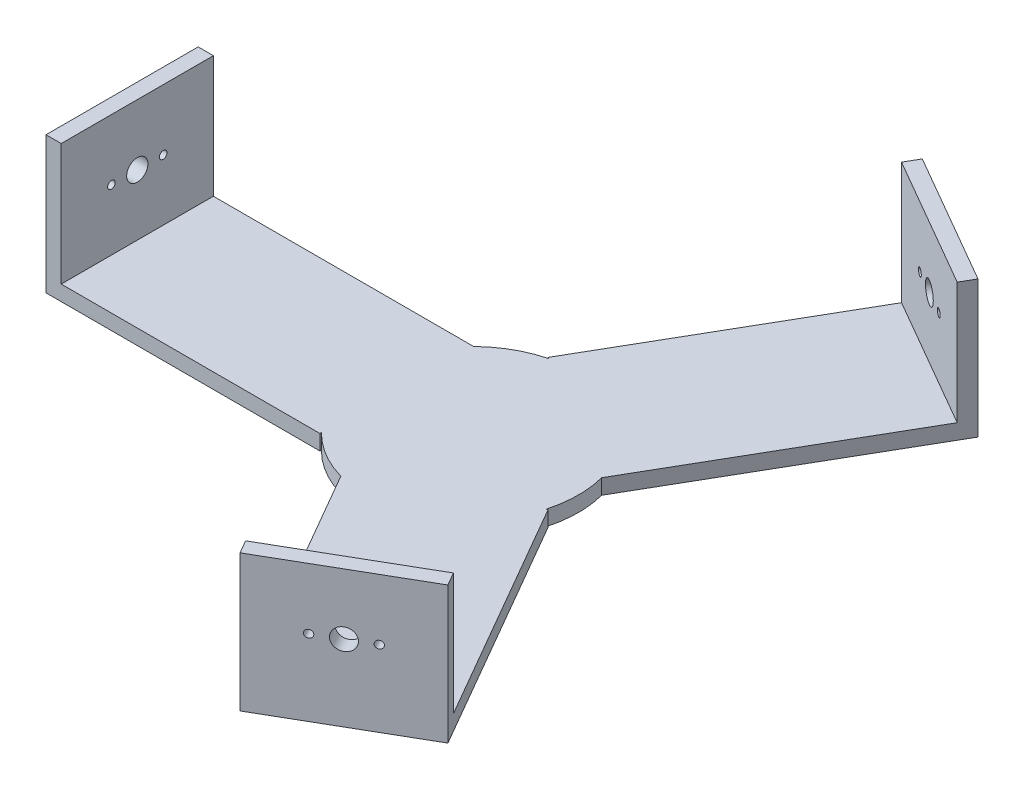
ISO-10303-21;
HEADER;
FILE_DESCRIPTION(('STEP AP214'),'2;1');
FILE_NAME('part.step','',(''),(''),'','','');
FILE_SCHEMA(('AUTOMOTIVE_DESIGN { 1 0 10303 214 1 1 1 1 }'));
ENDSEC;
DATA;
#1=APPLICATION_CONTEXT('core data for automotive mechanical design processes');
#2=APPLICATION_PROTOCOL_DEFINITION('international standard','automotive_design',2000,#1);
#3=PRODUCT_CONTEXT('',#1,'mechanical');
#4=PRODUCT('Part','Part','',(#3));
#5=PRODUCT_RELATED_PRODUCT_CATEGORY('part','',(#4));
#6=PRODUCT_DEFINITION_FORMATION('','',#4);
#7=PRODUCT_DEFINITION_CONTEXT('part definition',#1,'design');
#8=PRODUCT_DEFINITION('design','',#6,#7);
#9=PRODUCT_DEFINITION_SHAPE('','',#8);
#10=(LENGTH_UNIT() NAMED_UNIT(*) SI_UNIT(.MILLI.,.METRE.));
#11=(NAMED_UNIT(*) PLANE_ANGLE_UNIT() SI_UNIT($,.RADIAN.));
#12=(NAMED_UNIT(*) SI_UNIT($,.STERADIAN.) SOLID_ANGLE_UNIT());
#13=UNCERTAINTY_MEASURE_WITH_UNIT(LENGTH_MEASURE(1.E-05),#10,'distance_accuracy_value','');
#14=(GEOMETRIC_REPRESENTATION_CONTEXT(3) GLOBAL_UNCERTAINTY_ASSIGNED_CONTEXT((#13)) GLOBAL_UNIT_ASSIGNED_CONTEXT((#10,
#11,#12)) REPRESENTATION_CONTEXT('',''));
#15=CARTESIAN_POINT('',(0.,0.,0.));
#16=DIRECTION('',(0.,0.,1.));
#17=DIRECTION('',(1.,0.,0.));
#18=AXIS2_PLACEMENT_3D('',#15,#16,#17);
#19=CARTESIAN_POINT('',(0.,5.,0.));
#20=DIRECTION('',(0.,1.,0.));
#21=DIRECTION('',(0.,0.,1.));
#22=AXIS2_PLACEMENT_3D('',#19,#20,#21);
#23=PLANE('',#22);
#24=DIRECTION('',(0.5,0.,0.866025403784438));
#25=VECTOR('',#24,1.);
#26=CARTESIAN_POINT('',(-21.6506350945769,5.,12.4999999999803));
#27=LINE('',#26,#25);
#28=CARTESIAN_POINT('',(-9.40318638064095,5.,33.7132034356115));
#29=VERTEX_POINT('',#28);
#30=CARTESIAN_POINT('',(33.3493649054231,5.,107.762794416269));
#31=VERTEX_POINT('',#30);
#32=EDGE_CURVE('E213',#29,#31,#27,.T.);
#33=ORIENTED_EDGE('',*,*,#32,.T.);
#34=DIRECTION('',(-0.866025403784439,0.,0.5));
#35=VECTOR('',#34,1.);
#36=CARTESIAN_POINT('',(76.6506350946586,5.,82.7627944162608));
#37=LINE('',#36,#35);
#38=CARTESIAN_POINT('',(76.6506350946587,5.,82.7627944162608));
#39=VERTEX_POINT('',#38);
#40=EDGE_CURVE('E208',#39,#31,#37,.T.);
#41=ORIENTED_EDGE('',*,*,#40,.F.);
#42=DIRECTION('',(0.500000000000001,0.,0.866025403784438));
#43=VECTOR('',#42,1.);
#44=CARTESIAN_POINT('',(21.6506350946586,5.,-12.5000000000275));
#45=LINE('',#44,#43);
#46=CARTESIAN_POINT('',(34.1506350946586,5.,9.15063509458348));
#47=VERTEX_POINT('',#46);
#48=EDGE_CURVE('E475',#47,#39,#45,.T.);
#49=ORIENTED_EDGE('',*,*,#48,.F.);
#50=DIRECTION('',(0.871031985603914,0.,-0.49122630228328));
#51=VECTOR('',#50,1.);
#52=CARTESIAN_POINT('',(12.1559774709925,5.,21.5547195748672));
#53=LINE('',#52,#51);
#54=CARTESIAN_POINT('',(33.715141322626,5.,9.39623571412291));
#55=VERTEX_POINT('',#54);
#56=EDGE_CURVE('E479',#55,#47,#53,.T.);
#57=ORIENTED_EDGE('',*,*,#56,.F.);
#58=CARTESIAN_POINT('',(0.,5.,0.));
#59=DIRECTION('',(0.,1.,0.));
#60=DIRECTION('',(0.,0.,1.));
#61=AXIS2_PLACEMENT_3D('',#58,#59,#60);
#62=CIRCLE('',#61,35.);
#63=CARTESIAN_POINT('',(33.8980838085129,5.,-8.71320343565085));
#64=VERTEX_POINT('',#63);
#65=EDGE_CURVE('E504',#55,#64,#62,.T.);
#66=ORIENTED_EDGE('',*,*,#65,.T.);
#67=DIRECTION('',(0.5,0.,-0.866025403784439));
#68=VECTOR('',#67,1.);
#69=CARTESIAN_POINT('',(21.6506350945769,5.,12.4999999999803));
#70=LINE('',#69,#68);
#71=CARTESIAN_POINT('',(76.6506350945769,5.,-82.7627944163079));
#72=VERTEX_POINT('',#71);
#73=EDGE_CURVE('E508',#64,#72,#70,.T.);
#74=ORIENTED_EDGE('',*,*,#73,.T.);
#75=DIRECTION('',(0.866025403784439,0.,0.5));
#76=VECTOR('',#75,1.);
#77=CARTESIAN_POINT('',(76.6506350945769,5.,-82.7627944163079));
#78=LINE('',#77,#76);
#79=CARTESIAN_POINT('',(33.3493649053414,5.,-107.762794416316));
#80=VERTEX_POINT('',#79);
#81=EDGE_CURVE('E382',#80,#72,#78,.T.);
#82=ORIENTED_EDGE('',*,*,#81,.F.);
#83=DIRECTION('',(0.5,0.,-0.866025403784439));
#84=VECTOR('',#83,1.);
#85=CARTESIAN_POINT('',(-21.6506350946586,5.,-12.5000000000275));
#86=LINE('',#85,#84);
#87=CARTESIAN_POINT('',(-9.15063509465858,5.,-34.1506350946385));
#88=VERTEX_POINT('',#87);
#89=EDGE_CURVE('E515',#88,#80,#86,.T.);
#90=ORIENTED_EDGE('',*,*,#89,.F.);
#91=DIRECTION('',(0.86093044958637,0.,0.508722675900151));
#92=VECTOR('',#91,1.);
#93=CARTESIAN_POINT('',(12.5889459877885,5.,-21.3047450851444));
#94=LINE('',#93,#92);
#95=CARTESIAN_POINT('',(-8.72019183293593,5.,-33.896286734638));
#96=VERTEX_POINT('',#95);
#97=EDGE_CURVE('E519',#88,#96,#94,.T.);
#98=ORIENTED_EDGE('',*,*,#97,.T.);
#99=CARTESIAN_POINT('',(-24.4948974278719,5.,-24.9999999999607));
#100=VERTEX_POINT('',#99);
#101=EDGE_CURVE('E511',#96,#100,#62,.T.);
#102=ORIENTED_EDGE('',*,*,#101,.T.);
#103=DIRECTION('',(1.,0.,0.));
#104=VECTOR('',#103,1.);
#105=CARTESIAN_POINT('',(0.,5.,-24.9999999999607));
#106=LINE('',#105,#104);
#107=CARTESIAN_POINT('',(-110.,5.,-24.9999999999607));
#108=VERTEX_POINT('',#107);
#109=EDGE_CURVE('E434',#108,#100,#106,.T.);
#110=ORIENTED_EDGE('',*,*,#109,.F.);
#111=DIRECTION('',(0.,0.,-1.));
#112=VECTOR('',#111,1.);
#113=CARTESIAN_POINT('',(-110.,5.,-24.9999999999607));
#114=LINE('',#113,#112);
#115=CARTESIAN_POINT('',(-110.,5.,25.000000000055));
#116=VERTEX_POINT('',#115);
#117=EDGE_CURVE('E407',#116,#108,#114,.T.);
#118=ORIENTED_EDGE('',*,*,#117,.F.);
#119=DIRECTION('',(-1.,0.,0.));
#120=VECTOR('',#119,1.);
#121=CARTESIAN_POINT('',(0.,5.,25.000000000055));
#122=LINE('',#121,#120);
#123=CARTESIAN_POINT('',(-25.,5.,25.000000000055));
#124=VERTEX_POINT('',#123);
#125=EDGE_CURVE('E437',#124,#116,#122,.T.);
#126=ORIENTED_EDGE('',*,*,#125,.F.);
#127=DIRECTION('',(-0.0101015360175433,0.,0.99994897818343));
#128=VECTOR('',#127,1.);
#129=CARTESIAN_POINT('',(-24.744923458781,5.,-0.249974489722791));
#130=LINE('',#129,#128);
#131=CARTESIAN_POINT('',(-24.9949494896901,5.,24.5000510205151));
#132=VERTEX_POINT('',#131);
#133=EDGE_CURVE('E442',#132,#124,#130,.T.);
#134=ORIENTED_EDGE('',*,*,#133,.F.);
#135=EDGE_CURVE('E510',#132,#29,#62,.T.);
#136=ORIENTED_EDGE('',*,*,#135,.T.);
#137=EDGE_LOOP('',(#33,#41,#49,#57,#66,#74,#82,#90,#98,#102,#110,#118,#126,#134,#136));
#138=FACE_BOUND('',#137,.T.);
#139=ADVANCED_FACE('F190',(#138),#23,.T.);
#140=CARTESIAN_POINT('',(0.,5.,-24.9999999999607));
#141=DIRECTION('',(0.,0.,-1.));
#142=DIRECTION('',(-1.,0.,0.));
#143=AXIS2_PLACEMENT_3D('',#140,#141,#142);
#144=PLANE('',#143);
#145=DIRECTION('',(1.,0.,0.));
#146=VECTOR('',#145,1.);
#147=CARTESIAN_POINT('',(0.,0.,-24.9999999999607));
#148=LINE('',#147,#146);
#149=CARTESIAN_POINT('',(-115.,0.,-24.9999999999607));
#150=VERTEX_POINT('',#149);
#151=CARTESIAN_POINT('',(-24.4948974278719,0.,-24.9999999999607));
#152=VERTEX_POINT('',#151);
#153=EDGE_CURVE('E447',#150,#152,#148,.T.);
#154=ORIENTED_EDGE('',*,*,#153,.F.);
#155=DIRECTION('',(0.,-1.,0.));
#156=VECTOR('',#155,1.);
#157=CARTESIAN_POINT('',(-115.,5.,-24.9999999999607));
#158=LINE('',#157,#156);
#159=CARTESIAN_POINT('',(-115.,45.,-24.9999999999607));
#160=VERTEX_POINT('',#159);
#161=EDGE_CURVE('E200',#160,#150,#158,.T.);
#162=ORIENTED_EDGE('',*,*,#161,.F.);
#163=DIRECTION('',(-1.,0.,0.));
#164=VECTOR('',#163,1.);
#165=CARTESIAN_POINT('',(-115.,45.,-24.9999999999607));
#166=LINE('',#165,#164);
#167=CARTESIAN_POINT('',(-110.,45.,-24.9999999999607));
#168=VERTEX_POINT('',#167);
#169=EDGE_CURVE('E418',#168,#160,#166,.T.);
#170=ORIENTED_EDGE('',*,*,#169,.F.);
#171=DIRECTION('',(0.,-1.,0.));
#172=VECTOR('',#171,1.);
#173=CARTESIAN_POINT('',(-110.,45.,-24.9999999999607));
#174=LINE('',#173,#172);
#175=EDGE_CURVE('E422',#168,#108,#174,.T.);
#176=ORIENTED_EDGE('',*,*,#175,.T.);
#177=ORIENTED_EDGE('',*,*,#109,.T.);
#178=DIRECTION('',(0.,-1.,0.));
#179=VECTOR('',#178,1.);
#180=CARTESIAN_POINT('',(-24.4948974278719,5.,-24.9999999999607));
#181=LINE('',#180,#179);
#182=EDGE_CURVE('E12',#100,#152,#181,.T.);
#183=ORIENTED_EDGE('',*,*,#182,.T.);
#184=EDGE_LOOP('',(#154,#162,#170,#176,#177,#183));
#185=FACE_BOUND('',#184,.T.);
#186=ADVANCED_FACE('F613',(#185),#144,.T.);
#187=CARTESIAN_POINT('',(-115.,5.,0.));
#188=DIRECTION('',(-1.,0.,0.));
#189=DIRECTION('',(0.,0.,1.));
#190=AXIS2_PLACEMENT_3D('',#187,#188,#189);
#191=PLANE('',#190);
#192=CARTESIAN_POINT('',(-115.,25.,-8.5));
#193=DIRECTION('',(1.,0.,0.));
#194=DIRECTION('',(0.,0.,-1.));
#195=AXIS2_PLACEMENT_3D('',#192,#193,#194);
#196=CIRCLE('',#195,1.25);
#197=CARTESIAN_POINT('',(-115.,25.,-9.75));
#198=VERTEX_POINT('',#197);
#199=EDGE_CURVE('E695',#198,#198,#196,.T.);
#200=ORIENTED_EDGE('',*,*,#199,.T.);
#201=EDGE_LOOP('',(#200));
#202=FACE_BOUND('',#201,.T.);
#203=CARTESIAN_POINT('',(-115.,25.,8.5));
#204=DIRECTION('',(1.,0.,0.));
#205=DIRECTION('',(0.,0.,-1.));
#206=AXIS2_PLACEMENT_3D('',#203,#204,#205);
#207=CIRCLE('',#206,1.25);
#208=CARTESIAN_POINT('',(-115.,25.,7.25));
#209=VERTEX_POINT('',#208);
#210=EDGE_CURVE('E687',#209,#209,#207,.T.);
#211=ORIENTED_EDGE('',*,*,#210,.T.);
#212=EDGE_LOOP('',(#211));
#213=FACE_BOUND('',#212,.T.);
#214=CARTESIAN_POINT('',(-115.,25.,0.));
#215=DIRECTION('',(1.,0.,0.));
#216=DIRECTION('',(0.,0.,-1.));
#217=AXIS2_PLACEMENT_3D('',#214,#215,#216);
#218=CIRCLE('',#217,3.5);
#219=CARTESIAN_POINT('',(-115.,25.,-3.5));
#220=VERTEX_POINT('',#219);
#221=EDGE_CURVE('E366',#220,#220,#218,.T.);
#222=ORIENTED_EDGE('',*,*,#221,.T.);
#223=EDGE_LOOP('',(#222));
#224=FACE_BOUND('',#223,.T.);
#225=DIRECTION('',(0.,0.,-1.));
#226=VECTOR('',#225,1.);
#227=CARTESIAN_POINT('',(-115.,0.,0.));
#228=LINE('',#227,#226);
#229=CARTESIAN_POINT('',(-115.,0.,25.000000000055));
#230=VERTEX_POINT('',#229);
#231=EDGE_CURVE('E451',#230,#150,#228,.T.);
#232=ORIENTED_EDGE('',*,*,#231,.F.);
#233=DIRECTION('',(0.,-1.,0.));
#234=VECTOR('',#233,1.);
#235=CARTESIAN_POINT('',(-115.,5.,25.000000000055));
#236=LINE('',#235,#234);
#237=CARTESIAN_POINT('',(-115.,45.,25.000000000055));
#238=VERTEX_POINT('',#237);
#239=EDGE_CURVE('E468',#238,#230,#236,.T.);
#240=ORIENTED_EDGE('',*,*,#239,.F.);
#241=DIRECTION('',(0.,0.,1.));
#242=VECTOR('',#241,1.);
#243=CARTESIAN_POINT('',(-115.,45.,-24.9999999999607));
#244=LINE('',#243,#242);
#245=EDGE_CURVE('E408',#160,#238,#244,.T.);
#246=ORIENTED_EDGE('',*,*,#245,.F.);
#247=ORIENTED_EDGE('',*,*,#161,.T.);
#248=EDGE_LOOP('',(#232,#240,#246,#247));
#249=FACE_BOUND('',#248,.T.);
#250=ADVANCED_FACE('F609',(#202,#213,#224,#249),#191,.T.);
#251=CARTESIAN_POINT('',(0.,5.,25.000000000055));
#252=DIRECTION('',(0.,0.,1.));
#253=DIRECTION('',(1.,0.,0.));
#254=AXIS2_PLACEMENT_3D('',#251,#252,#253);
#255=PLANE('',#254);
#256=DIRECTION('',(-1.,0.,0.));
#257=VECTOR('',#256,1.);
#258=CARTESIAN_POINT('',(0.,0.,25.000000000055));
#259=LINE('',#258,#257);
#260=CARTESIAN_POINT('',(-25.,0.,25.000000000055));
#261=VERTEX_POINT('',#260);
#262=EDGE_CURVE('E456',#261,#230,#259,.T.);
#263=ORIENTED_EDGE('',*,*,#262,.F.);
#264=DIRECTION('',(0.,-1.,0.));
#265=VECTOR('',#264,1.);
#266=CARTESIAN_POINT('',(-25.,5.,25.000000000055));
#267=LINE('',#266,#265);
#268=EDGE_CURVE('E465',#124,#261,#267,.T.);
#269=ORIENTED_EDGE('',*,*,#268,.F.);
#270=ORIENTED_EDGE('',*,*,#125,.T.);
#271=DIRECTION('',(0.,-1.,0.));
#272=VECTOR('',#271,1.);
#273=CARTESIAN_POINT('',(-110.,45.,25.000000000055));
#274=LINE('',#273,#272);
#275=CARTESIAN_POINT('',(-110.,45.,25.000000000055));
#276=VERTEX_POINT('',#275);
#277=EDGE_CURVE('E429',#276,#116,#274,.T.);
#278=ORIENTED_EDGE('',*,*,#277,.F.);
#279=DIRECTION('',(1.,0.,0.));
#280=VECTOR('',#279,1.);
#281=CARTESIAN_POINT('',(-115.,45.,25.000000000055));
#282=LINE('',#281,#280);
#283=EDGE_CURVE('E412',#238,#276,#282,.T.);
#284=ORIENTED_EDGE('',*,*,#283,.F.);
#285=ORIENTED_EDGE('',*,*,#239,.T.);
#286=EDGE_LOOP('',(#263,#269,#270,#278,#284,#285));
#287=FACE_BOUND('',#286,.T.);
#288=ADVANCED_FACE('F603',(#287),#255,.T.);
#289=CARTESIAN_POINT('',(-24.744923458781,5.,-0.249974489722791));
#290=DIRECTION('',(0.99994897818343,0.,0.0101015360175433));
#291=DIRECTION('',(0.0101015360175433,0.,-0.99994897818343));
#292=AXIS2_PLACEMENT_3D('',#289,#290,#291);
#293=PLANE('',#292);
#294=DIRECTION('',(-0.0101015360175433,0.,0.99994897818343));
#295=VECTOR('',#294,1.);
#296=CARTESIAN_POINT('',(-24.744923458781,0.,-0.249974489722791));
#297=LINE('',#296,#295);
#298=CARTESIAN_POINT('',(-24.9949494896901,0.,24.5000510205151));
#299=VERTEX_POINT('',#298);
#300=EDGE_CURVE('E438',#299,#261,#297,.T.);
#301=ORIENTED_EDGE('',*,*,#300,.F.);
#302=DIRECTION('',(0.,-1.,0.));
#303=VECTOR('',#302,1.);
#304=CARTESIAN_POINT('',(-24.9949494896901,5.,24.5000510205151));
#305=LINE('',#304,#303);
#306=EDGE_CURVE('E446',#132,#299,#305,.T.);
#307=ORIENTED_EDGE('',*,*,#306,.F.);
#308=ORIENTED_EDGE('',*,*,#133,.T.);
#309=ORIENTED_EDGE('',*,*,#268,.T.);
#310=EDGE_LOOP('',(#301,#307,#308,#309));
#311=FACE_BOUND('',#310,.T.);
#312=ADVANCED_FACE('F597',(#311),#293,.T.);
#313=CARTESIAN_POINT('',(0.,0.,0.));
#314=DIRECTION('',(0.,1.,0.));
#315=DIRECTION('',(0.,0.,1.));
#316=AXIS2_PLACEMENT_3D('',#313,#314,#315);
#317=PLANE('',#316);
#318=ORIENTED_EDGE('',*,*,#153,.T.);
#319=CARTESIAN_POINT('',(0.,0.,0.));
#320=DIRECTION('',(0.,1.,0.));
#321=DIRECTION('',(0.,0.,1.));
#322=AXIS2_PLACEMENT_3D('',#319,#320,#321);
#323=CIRCLE('',#322,35.);
#324=CARTESIAN_POINT('',(-8.72019183293593,0.,-33.896286734638));
#325=VERTEX_POINT('',#324);
#326=EDGE_CURVE('E527',#325,#152,#323,.T.);
#327=ORIENTED_EDGE('',*,*,#326,.F.);
#328=DIRECTION('',(0.86093044958637,0.,0.508722675900151));
#329=VECTOR('',#328,1.);
#330=CARTESIAN_POINT('',(12.5889459877885,0.,-21.3047450851444));
#331=LINE('',#330,#329);
#332=CARTESIAN_POINT('',(-9.15063509465858,0.,-34.1506350946385));
#333=VERTEX_POINT('',#332);
#334=EDGE_CURVE('E539',#333,#325,#331,.T.);
#335=ORIENTED_EDGE('',*,*,#334,.F.);
#336=DIRECTION('',(0.5,0.,-0.866025403784439));
#337=VECTOR('',#336,1.);
#338=CARTESIAN_POINT('',(-21.6506350946586,0.,-12.5000000000275));
#339=LINE('',#338,#337);
#340=CARTESIAN_POINT('',(35.8493649053414,0.,-112.092921435238));
#341=VERTEX_POINT('',#340);
#342=EDGE_CURVE('E535',#333,#341,#339,.T.);
#343=ORIENTED_EDGE('',*,*,#342,.T.);
#344=DIRECTION('',(0.866025403784439,0.,0.5));
#345=VECTOR('',#344,1.);
#346=CARTESIAN_POINT('',(57.5,0.,-99.5929214352105));
#347=LINE('',#346,#345);
#348=CARTESIAN_POINT('',(79.1506350945769,0.,-87.0929214352301));
#349=VERTEX_POINT('',#348);
#350=EDGE_CURVE('E531',#341,#349,#347,.T.);
#351=ORIENTED_EDGE('',*,*,#350,.T.);
#352=DIRECTION('',(0.5,0.,-0.866025403784439));
#353=VECTOR('',#352,1.);
#354=CARTESIAN_POINT('',(21.6506350945769,0.,12.4999999999803));
#355=LINE('',#354,#353);
#356=CARTESIAN_POINT('',(33.8980838085129,0.,-8.71320343565085));
#357=VERTEX_POINT('',#356);
#358=EDGE_CURVE('E526',#357,#349,#355,.T.);
#359=ORIENTED_EDGE('',*,*,#358,.F.);
#360=CARTESIAN_POINT('',(33.715141322626,0.,9.39623571412291));
#361=VERTEX_POINT('',#360);
#362=EDGE_CURVE('E433',#361,#357,#323,.T.);
#363=ORIENTED_EDGE('',*,*,#362,.F.);
#364=DIRECTION('',(0.871031985603914,0.,-0.49122630228328));
#365=VECTOR('',#364,1.);
#366=CARTESIAN_POINT('',(12.1559774709925,0.,21.5547195748672));
#367=LINE('',#366,#365);
#368=CARTESIAN_POINT('',(34.1506350946586,0.,9.15063509458348));
#369=VERTEX_POINT('',#368);
#370=EDGE_CURVE('E476',#361,#369,#367,.T.);
#371=ORIENTED_EDGE('',*,*,#370,.T.);
#372=DIRECTION('',(0.500000000000001,0.,0.866025403784438));
#373=VECTOR('',#372,1.);
#374=CARTESIAN_POINT('',(21.6506350946586,0.,-12.5000000000275));
#375=LINE('',#374,#373);
#376=CARTESIAN_POINT('',(79.1506350946587,0.,87.0929214351829));
#377=VERTEX_POINT('',#376);
#378=EDGE_CURVE('E490',#369,#377,#375,.T.);
#379=ORIENTED_EDGE('',*,*,#378,.T.);
#380=DIRECTION('',(-0.866025403784438,0.,0.5));
#381=VECTOR('',#380,1.);
#382=CARTESIAN_POINT('',(57.5000000000001,0.,99.5929214352104));
#383=LINE('',#382,#381);
#384=CARTESIAN_POINT('',(35.8493649054231,0.,112.092921435191));
#385=VERTEX_POINT('',#384);
#386=EDGE_CURVE('E341',#377,#385,#383,.T.);
#387=ORIENTED_EDGE('',*,*,#386,.T.);
#388=DIRECTION('',(0.5,0.,0.866025403784438));
#389=VECTOR('',#388,1.);
#390=CARTESIAN_POINT('',(-21.6506350945769,0.,12.4999999999803));
#391=LINE('',#390,#389);
#392=CARTESIAN_POINT('',(-9.40318638064095,0.,33.7132034356115));
#393=VERTEX_POINT('',#392);
#394=EDGE_CURVE('E484',#393,#385,#391,.T.);
#395=ORIENTED_EDGE('',*,*,#394,.F.);
#396=EDGE_CURVE('E509',#299,#393,#323,.T.);
#397=ORIENTED_EDGE('',*,*,#396,.F.);
#398=ORIENTED_EDGE('',*,*,#300,.T.);
#399=ORIENTED_EDGE('',*,*,#262,.T.);
#400=ORIENTED_EDGE('',*,*,#231,.T.);
#401=EDGE_LOOP('',(#318,#327,#335,#343,#351,#359,#363,#371,#379,#387,#395,#397,#398,#399,#400));
#402=FACE_BOUND('',#401,.T.);
#403=ADVANCED_FACE('F566',(#402),#317,.F.);
#404=CARTESIAN_POINT('',(21.6506350946586,5.,-12.5000000000275));
#405=DIRECTION('',(0.866025403784438,0.,-0.500000000000001));
#406=DIRECTION('',(-0.500000000000001,0.,-0.866025403784438));
#407=AXIS2_PLACEMENT_3D('',#404,#405,#406);
#408=PLANE('',#407);
#409=ORIENTED_EDGE('',*,*,#378,.F.);
#410=DIRECTION('',(0.,-1.,0.));
#411=VECTOR('',#410,1.);
#412=CARTESIAN_POINT('',(34.1506350946586,5.,9.15063509458348));
#413=LINE('',#412,#411);
#414=EDGE_CURVE('E347',#47,#369,#413,.T.);
#415=ORIENTED_EDGE('',*,*,#414,.F.);
#416=ORIENTED_EDGE('',*,*,#48,.T.);
#417=DIRECTION('',(0.,-1.,0.));
#418=VECTOR('',#417,1.);
#419=CARTESIAN_POINT('',(76.6506350946586,45.,82.7627944162608));
#420=LINE('',#419,#418);
#421=CARTESIAN_POINT('',(76.6506350946586,45.,82.7627944162608));
#422=VERTEX_POINT('',#421);
#423=EDGE_CURVE('E353',#422,#39,#420,.T.);
#424=ORIENTED_EDGE('',*,*,#423,.F.);
#425=DIRECTION('',(-0.500000000000012,0.,-0.866025403784432));
#426=VECTOR('',#425,1.);
#427=CARTESIAN_POINT('',(79.1506350946587,45.,87.0929214351829));
#428=LINE('',#427,#426);
#429=CARTESIAN_POINT('',(79.1506350946587,45.,87.0929214351829));
#430=VERTEX_POINT('',#429);
#431=EDGE_CURVE('E350',#430,#422,#428,.T.);
#432=ORIENTED_EDGE('',*,*,#431,.F.);
#433=DIRECTION('',(0.,-1.,0.));
#434=VECTOR('',#433,1.);
#435=CARTESIAN_POINT('',(79.1506350946587,5.,87.0929214351829));
#436=LINE('',#435,#434);
#437=EDGE_CURVE('E335',#430,#377,#436,.T.);
#438=ORIENTED_EDGE('',*,*,#437,.T.);
#439=EDGE_LOOP('',(#409,#415,#416,#424,#432,#438));
#440=FACE_BOUND('',#439,.T.);
#441=ADVANCED_FACE('F351',(#440),#408,.T.);
#442=CARTESIAN_POINT('',(12.1559774709925,5.,21.5547195748672));
#443=DIRECTION('',(-0.49122630228328,0.,-0.871031985603913));
#444=DIRECTION('',(-0.871031985603913,0.,0.49122630228328));
#445=AXIS2_PLACEMENT_3D('',#442,#443,#444);
#446=PLANE('',#445);
#447=ORIENTED_EDGE('',*,*,#370,.F.);
#448=DIRECTION('',(0.,-1.,0.));
#449=VECTOR('',#448,1.);
#450=CARTESIAN_POINT('',(33.715141322626,5.,9.39623571412291));
#451=LINE('',#450,#449);
#452=EDGE_CURVE('E483',#55,#361,#451,.T.);
#453=ORIENTED_EDGE('',*,*,#452,.F.);
#454=ORIENTED_EDGE('',*,*,#56,.T.);
#455=ORIENTED_EDGE('',*,*,#414,.T.);
#456=EDGE_LOOP('',(#447,#453,#454,#455));
#457=FACE_BOUND('',#456,.T.);
#458=ADVANCED_FACE('F584',(#457),#446,.T.);
#459=CARTESIAN_POINT('',(21.6506350945769,5.,12.4999999999803));
#460=DIRECTION('',(-0.866025403784439,0.,-0.5));
#461=DIRECTION('',(-0.5,0.,0.866025403784439));
#462=AXIS2_PLACEMENT_3D('',#459,#460,#461);
#463=PLANE('',#462);
#464=ORIENTED_EDGE('',*,*,#358,.T.);
#465=DIRECTION('',(0.,-1.,0.));
#466=VECTOR('',#465,1.);
#467=CARTESIAN_POINT('',(79.1506350945769,5.,-87.0929214352301));
#468=LINE('',#467,#466);
#469=CARTESIAN_POINT('',(79.1506350945769,45.,-87.0929214352301));
#470=VERTEX_POINT('',#469);
#471=EDGE_CURVE('E551',#470,#349,#468,.T.);
#472=ORIENTED_EDGE('',*,*,#471,.F.);
#473=DIRECTION('',(0.499999999999998,0.,-0.86602540378444));
#474=VECTOR('',#473,1.);
#475=CARTESIAN_POINT('',(79.1506350945769,45.,-87.0929214352301));
#476=LINE('',#475,#474);
#477=CARTESIAN_POINT('',(76.6506350945769,45.,-82.7627944163079));
#478=VERTEX_POINT('',#477);
#479=EDGE_CURVE('E390',#478,#470,#476,.T.);
#480=ORIENTED_EDGE('',*,*,#479,.F.);
#481=DIRECTION('',(0.,-1.,0.));
#482=VECTOR('',#481,1.);
#483=CARTESIAN_POINT('',(76.6506350945769,45.,-82.7627944163079));
#484=LINE('',#483,#482);
#485=EDGE_CURVE('E398',#478,#72,#484,.T.);
#486=ORIENTED_EDGE('',*,*,#485,.T.);
#487=ORIENTED_EDGE('',*,*,#73,.F.);
#488=DIRECTION('',(0.,-1.,0.));
#489=VECTOR('',#488,1.);
#490=CARTESIAN_POINT('',(33.8980838085129,5.,-8.71320343565085));
#491=LINE('',#490,#489);
#492=EDGE_CURVE('E194',#64,#357,#491,.T.);
#493=ORIENTED_EDGE('',*,*,#492,.T.);
#494=EDGE_LOOP('',(#464,#472,#480,#486,#487,#493));
#495=FACE_BOUND('',#494,.T.);
#496=ADVANCED_FACE('F192',(#495),#463,.F.);
#497=CARTESIAN_POINT('',(57.5,5.,-99.5929214352105));
#498=DIRECTION('',(0.5,0.,-0.866025403784439));
#499=DIRECTION('',(-0.866025403784439,0.,-0.5));
#500=AXIS2_PLACEMENT_3D('',#497,#498,#499);
#501=PLANE('',#500);
#502=CARTESIAN_POINT('',(64.8612159321269,25.,-95.342921435234));
#503=DIRECTION('',(0.5,0.,-0.866025403784439));
#504=DIRECTION('',(-0.866025403784439,0.,-0.5));
#505=AXIS2_PLACEMENT_3D('',#502,#503,#504);
#506=CIRCLE('',#505,1.24999999999999);
#507=CARTESIAN_POINT('',(63.7786841773964,25.,-95.967921435234));
#508=VERTEX_POINT('',#507);
#509=EDGE_CURVE('E853',#508,#508,#506,.T.);
#510=ORIENTED_EDGE('',*,*,#509,.F.);
#511=EDGE_LOOP('',(#510));
#512=FACE_BOUND('',#511,.T.);
#513=CARTESIAN_POINT('',(50.1387840677914,25.,-103.842921435234));
#514=DIRECTION('',(0.5,0.,-0.866025403784439));
#515=DIRECTION('',(-0.866025403784439,0.,-0.5));
#516=AXIS2_PLACEMENT_3D('',#513,#514,#515);
#517=CIRCLE('',#516,1.25000000000001);
#518=CARTESIAN_POINT('',(49.0562523130609,25.,-104.467921435234));
#519=VERTEX_POINT('',#518);
#520=EDGE_CURVE('E872',#519,#519,#517,.T.);
#521=ORIENTED_EDGE('',*,*,#520,.F.);
#522=EDGE_LOOP('',(#521));
#523=FACE_BOUND('',#522,.T.);
#524=CARTESIAN_POINT('',(57.4999999999592,25.,-99.592921435234));
#525=DIRECTION('',(0.5,0.,-0.866025403784439));
#526=DIRECTION('',(-0.866025403784439,0.,-0.5));
#527=AXIS2_PLACEMENT_3D('',#524,#525,#526);
#528=CIRCLE('',#527,3.5);
#529=CARTESIAN_POINT('',(54.4689110867136,25.,-101.342921435234));
#530=VERTEX_POINT('',#529);
#531=EDGE_CURVE('E864',#530,#530,#528,.T.);
#532=ORIENTED_EDGE('',*,*,#531,.F.);
#533=EDGE_LOOP('',(#532));
#534=FACE_BOUND('',#533,.T.);
#535=ORIENTED_EDGE('',*,*,#350,.F.);
#536=DIRECTION('',(0.,-1.,0.));
#537=VECTOR('',#536,1.);
#538=CARTESIAN_POINT('',(35.8493649053414,5.,-112.092921435238));
#539=LINE('',#538,#537);
#540=CARTESIAN_POINT('',(35.8493649053414,45.,-112.092921435238));
#541=VERTEX_POINT('',#540);
#542=EDGE_CURVE('E549',#541,#341,#539,.T.);
#543=ORIENTED_EDGE('',*,*,#542,.F.);
#544=DIRECTION('',(-0.866025403784439,0.,-0.5));
#545=VECTOR('',#544,1.);
#546=CARTESIAN_POINT('',(35.8493649053414,45.,-112.092921435238));
#547=LINE('',#546,#545);
#548=EDGE_CURVE('E394',#470,#541,#547,.T.);
#549=ORIENTED_EDGE('',*,*,#548,.F.);
#550=ORIENTED_EDGE('',*,*,#471,.T.);
#551=EDGE_LOOP('',(#535,#543,#549,#550));
#552=FACE_BOUND('',#551,.T.);
#553=ADVANCED_FACE('F569',(#512,#523,#534,#552),#501,.T.);
#554=CARTESIAN_POINT('',(-21.6506350946586,5.,-12.5000000000275));
#555=DIRECTION('',(-0.866025403784439,0.,-0.5));
#556=DIRECTION('',(-0.5,0.,0.866025403784439));
#557=AXIS2_PLACEMENT_3D('',#554,#555,#556);
#558=PLANE('',#557);
#559=ORIENTED_EDGE('',*,*,#342,.F.);
#560=DIRECTION('',(0.,-1.,0.));
#561=VECTOR('',#560,1.);
#562=CARTESIAN_POINT('',(-9.15063509465858,5.,-34.1506350946385));
#563=LINE('',#562,#561);
#564=EDGE_CURVE('E546',#88,#333,#563,.T.);
#565=ORIENTED_EDGE('',*,*,#564,.F.);
#566=ORIENTED_EDGE('',*,*,#89,.T.);
#567=DIRECTION('',(0.,-1.,0.));
#568=VECTOR('',#567,1.);
#569=CARTESIAN_POINT('',(33.3493649053414,45.,-107.762794416316));
#570=LINE('',#569,#568);
#571=CARTESIAN_POINT('',(33.3493649053414,45.,-107.762794416316));
#572=VERTEX_POINT('',#571);
#573=EDGE_CURVE('E404',#572,#80,#570,.T.);
#574=ORIENTED_EDGE('',*,*,#573,.F.);
#575=DIRECTION('',(-0.499999999999993,0.,0.866025403784442));
#576=VECTOR('',#575,1.);
#577=CARTESIAN_POINT('',(33.3493649053414,45.,-107.762794416316));
#578=LINE('',#577,#576);
#579=EDGE_CURVE('E383',#541,#572,#578,.T.);
#580=ORIENTED_EDGE('',*,*,#579,.F.);
#581=ORIENTED_EDGE('',*,*,#542,.T.);
#582=EDGE_LOOP('',(#559,#565,#566,#574,#580,#581));
#583=FACE_BOUND('',#582,.T.);
#584=ADVANCED_FACE('F576',(#583),#558,.T.);
#585=CARTESIAN_POINT('',(57.5000000000001,5.,99.5929214352104));
#586=DIRECTION('',(0.5,0.,0.866025403784438));
#587=DIRECTION('',(0.866025403784438,0.,-0.5));
#588=AXIS2_PLACEMENT_3D('',#585,#586,#587);
#589=PLANE('',#588);
#590=CARTESIAN_POINT('',(64.8612159322086,25.,95.3429214351868));
#591=DIRECTION('',(0.5,0.,0.866025403784438));
#592=DIRECTION('',(0.866025403784438,0.,-0.5));
#593=AXIS2_PLACEMENT_3D('',#590,#591,#592);
#594=CIRCLE('',#593,1.25);
#595=CARTESIAN_POINT('',(65.9437476869392,25.,94.7179214351868));
#596=VERTEX_POINT('',#595);
#597=EDGE_CURVE('E664',#596,#596,#594,.T.);
#598=ORIENTED_EDGE('',*,*,#597,.F.);
#599=EDGE_LOOP('',(#598));
#600=FACE_BOUND('',#599,.T.);
#601=CARTESIAN_POINT('',(50.1387840678732,25.,103.842921435187));
#602=DIRECTION('',(0.5,0.,0.866025403784438));
#603=DIRECTION('',(0.866025403784438,0.,-0.5));
#604=AXIS2_PLACEMENT_3D('',#601,#602,#603);
#605=CIRCLE('',#604,1.25);
#606=CARTESIAN_POINT('',(51.2213158226037,25.,103.217921435187));
#607=VERTEX_POINT('',#606);
#608=EDGE_CURVE('E668',#607,#607,#605,.T.);
#609=ORIENTED_EDGE('',*,*,#608,.F.);
#610=EDGE_LOOP('',(#609));
#611=FACE_BOUND('',#610,.T.);
#612=CARTESIAN_POINT('',(57.5000000000409,25.,99.5929214351869));
#613=DIRECTION('',(0.5,0.,0.866025403784438));
#614=DIRECTION('',(0.866025403784438,0.,-0.5));
#615=AXIS2_PLACEMENT_3D('',#612,#613,#614);
#616=CIRCLE('',#615,3.5);
#617=CARTESIAN_POINT('',(60.5310889132864,25.,97.8429214351869));
#618=VERTEX_POINT('',#617);
#619=EDGE_CURVE('E671',#618,#618,#616,.T.);
#620=ORIENTED_EDGE('',*,*,#619,.F.);
#621=EDGE_LOOP('',(#620));
#622=FACE_BOUND('',#621,.T.);
#623=ORIENTED_EDGE('',*,*,#386,.F.);
#624=ORIENTED_EDGE('',*,*,#437,.F.);
#625=DIRECTION('',(0.866025403784438,0.,-0.500000000000001));
#626=VECTOR('',#625,1.);
#627=CARTESIAN_POINT('',(35.8493649054231,45.,112.092921435191));
#628=LINE('',#627,#626);
#629=CARTESIAN_POINT('',(35.8493649054231,45.,112.092921435191));
#630=VERTEX_POINT('',#629);
#631=EDGE_CURVE('E339',#630,#430,#628,.T.);
#632=ORIENTED_EDGE('',*,*,#631,.F.);
#633=DIRECTION('',(0.,-1.,0.));
#634=VECTOR('',#633,1.);
#635=CARTESIAN_POINT('',(35.8493649054231,5.,112.092921435191));
#636=LINE('',#635,#634);
#637=EDGE_CURVE('E346',#630,#385,#636,.T.);
#638=ORIENTED_EDGE('',*,*,#637,.T.);
#639=EDGE_LOOP('',(#623,#624,#632,#638));
#640=FACE_BOUND('',#639,.T.);
#641=ADVANCED_FACE('F337',(#600,#611,#622,#640),#589,.T.);
#642=CARTESIAN_POINT('',(0.,5.,0.));
#643=DIRECTION('',(0.,-1.,0.));
#644=DIRECTION('',(0.,0.,-1.));
#645=AXIS2_PLACEMENT_3D('',#642,#643,#644);
#646=CYLINDRICAL_SURFACE('',#645,35.);
#647=ORIENTED_EDGE('',*,*,#362,.T.);
#648=ORIENTED_EDGE('',*,*,#492,.F.);
#649=ORIENTED_EDGE('',*,*,#65,.F.);
#650=ORIENTED_EDGE('',*,*,#452,.T.);
#651=EDGE_LOOP('',(#647,#648,#649,#650));
#652=FACE_BOUND('',#651,.T.);
#653=ADVANCED_FACE('F563',(#652),#646,.T.);
#654=CARTESIAN_POINT('',(12.5889459877885,5.,-21.3047450851444));
#655=DIRECTION('',(0.508722675900151,0.,-0.86093044958637));
#656=DIRECTION('',(-0.86093044958637,0.,-0.508722675900151));
#657=AXIS2_PLACEMENT_3D('',#654,#655,#656);
#658=PLANE('',#657);
#659=ORIENTED_EDGE('',*,*,#334,.T.);
#660=DIRECTION('',(0.,-1.,0.));
#661=VECTOR('',#660,1.);
#662=CARTESIAN_POINT('',(-8.72019183293593,5.,-33.896286734638));
#663=LINE('',#662,#661);
#664=EDGE_CURVE('E543',#96,#325,#663,.T.);
#665=ORIENTED_EDGE('',*,*,#664,.F.);
#666=ORIENTED_EDGE('',*,*,#97,.F.);
#667=ORIENTED_EDGE('',*,*,#564,.T.);
#668=EDGE_LOOP('',(#659,#665,#666,#667));
#669=FACE_BOUND('',#668,.T.);
#670=ADVANCED_FACE('F631',(#669),#658,.F.);
#671=CARTESIAN_POINT('',(-21.6506350945769,5.,12.4999999999803));
#672=DIRECTION('',(0.866025403784438,0.,-0.5));
#673=DIRECTION('',(-0.5,0.,-0.866025403784438));
#674=AXIS2_PLACEMENT_3D('',#671,#672,#673);
#675=PLANE('',#674);
#676=ORIENTED_EDGE('',*,*,#394,.T.);
#677=ORIENTED_EDGE('',*,*,#637,.F.);
#678=DIRECTION('',(0.500000000000007,0.,0.866025403784434));
#679=VECTOR('',#678,1.);
#680=CARTESIAN_POINT('',(33.3493649054231,45.,107.762794416269));
#681=LINE('',#680,#679);
#682=CARTESIAN_POINT('',(33.3493649054231,45.,107.762794416269));
#683=VERTEX_POINT('',#682);
#684=EDGE_CURVE('E362',#683,#630,#681,.T.);
#685=ORIENTED_EDGE('',*,*,#684,.F.);
#686=DIRECTION('',(0.,-1.,0.));
#687=VECTOR('',#686,1.);
#688=CARTESIAN_POINT('',(33.3493649054231,45.,107.762794416269));
#689=LINE('',#688,#687);
#690=EDGE_CURVE('E375',#683,#31,#689,.T.);
#691=ORIENTED_EDGE('',*,*,#690,.T.);
#692=ORIENTED_EDGE('',*,*,#32,.F.);
#693=DIRECTION('',(0.,-1.,0.));
#694=VECTOR('',#693,1.);
#695=CARTESIAN_POINT('',(-9.40318638064095,5.,33.7132034356115));
#696=LINE('',#695,#694);
#697=EDGE_CURVE('E452',#29,#393,#696,.T.);
#698=ORIENTED_EDGE('',*,*,#697,.T.);
#699=EDGE_LOOP('',(#676,#677,#685,#691,#692,#698));
#700=FACE_BOUND('',#699,.T.);
#701=ADVANCED_FACE('F590',(#700),#675,.F.);
#702=ORIENTED_EDGE('',*,*,#396,.T.);
#703=ORIENTED_EDGE('',*,*,#697,.F.);
#704=ORIENTED_EDGE('',*,*,#135,.F.);
#705=ORIENTED_EDGE('',*,*,#306,.T.);
#706=EDGE_LOOP('',(#702,#703,#704,#705));
#707=FACE_BOUND('',#706,.T.);
#708=ADVANCED_FACE('F623',(#707),#646,.T.);
#709=ORIENTED_EDGE('',*,*,#326,.T.);
#710=ORIENTED_EDGE('',*,*,#182,.F.);
#711=ORIENTED_EDGE('',*,*,#101,.F.);
#712=ORIENTED_EDGE('',*,*,#664,.T.);
#713=EDGE_LOOP('',(#709,#710,#711,#712));
#714=FACE_BOUND('',#713,.T.);
#715=ADVANCED_FACE('F619',(#714),#646,.T.);
#716=CARTESIAN_POINT('',(-110.,45.,-24.9999999999607));
#717=DIRECTION('',(-1.,0.,0.));
#718=DIRECTION('',(0.,0.,1.));
#719=AXIS2_PLACEMENT_3D('',#716,#717,#718);
#720=PLANE('',#719);
#721=CARTESIAN_POINT('',(-110.,25.,-8.5));
#722=DIRECTION('',(1.,0.,0.));
#723=DIRECTION('',(0.,0.,-1.));
#724=AXIS2_PLACEMENT_3D('',#721,#722,#723);
#725=CIRCLE('',#724,1.25);
#726=CARTESIAN_POINT('',(-110.,25.,-9.75));
#727=VERTEX_POINT('',#726);
#728=EDGE_CURVE('E686',#727,#727,#725,.T.);
#729=ORIENTED_EDGE('',*,*,#728,.F.);
#730=EDGE_LOOP('',(#729));
#731=FACE_BOUND('',#730,.T.);
#732=CARTESIAN_POINT('',(-110.,25.,8.5));
#733=DIRECTION('',(1.,0.,0.));
#734=DIRECTION('',(0.,0.,-1.));
#735=AXIS2_PLACEMENT_3D('',#732,#733,#734);
#736=CIRCLE('',#735,1.25);
#737=CARTESIAN_POINT('',(-110.,25.,7.25));
#738=VERTEX_POINT('',#737);
#739=EDGE_CURVE('E691',#738,#738,#736,.T.);
#740=ORIENTED_EDGE('',*,*,#739,.F.);
#741=EDGE_LOOP('',(#740));
#742=FACE_BOUND('',#741,.T.);
#743=CARTESIAN_POINT('',(-110.,25.,0.));
#744=DIRECTION('',(1.,0.,0.));
#745=DIRECTION('',(0.,0.,-1.));
#746=AXIS2_PLACEMENT_3D('',#743,#744,#745);
#747=CIRCLE('',#746,3.5);
#748=CARTESIAN_POINT('',(-110.,25.,-3.5));
#749=VERTEX_POINT('',#748);
#750=EDGE_CURVE('E369',#749,#749,#747,.T.);
#751=ORIENTED_EDGE('',*,*,#750,.F.);
#752=EDGE_LOOP('',(#751));
#753=FACE_BOUND('',#752,.T.);
#754=ORIENTED_EDGE('',*,*,#117,.T.);
#755=ORIENTED_EDGE('',*,*,#175,.F.);
#756=DIRECTION('',(0.,0.,-1.));
#757=VECTOR('',#756,1.);
#758=CARTESIAN_POINT('',(-110.,45.,-24.9999999999607));
#759=LINE('',#758,#757);
#760=EDGE_CURVE('E415',#276,#168,#759,.T.);
#761=ORIENTED_EDGE('',*,*,#760,.F.);
#762=ORIENTED_EDGE('',*,*,#277,.T.);
#763=EDGE_LOOP('',(#754,#755,#761,#762));
#764=FACE_BOUND('',#763,.T.);
#765=ADVANCED_FACE('F626',(#731,#742,#753,#764),#720,.F.);
#766=CARTESIAN_POINT('',(0.,45.,0.));
#767=DIRECTION('',(0.,1.,0.));
#768=DIRECTION('',(0.,0.,1.));
#769=AXIS2_PLACEMENT_3D('',#766,#767,#768);
#770=PLANE('',#769);
#771=ORIENTED_EDGE('',*,*,#245,.T.);
#772=ORIENTED_EDGE('',*,*,#283,.T.);
#773=ORIENTED_EDGE('',*,*,#760,.T.);
#774=ORIENTED_EDGE('',*,*,#169,.T.);
#775=EDGE_LOOP('',(#771,#772,#773,#774));
#776=FACE_BOUND('',#775,.T.);
#777=ADVANCED_FACE('F636',(#776),#770,.T.);
#778=CARTESIAN_POINT('',(76.6506350945769,45.,-82.7627944163079));
#779=DIRECTION('',(0.5,0.,-0.866025403784439));
#780=DIRECTION('',(-0.866025403784439,0.,-0.5));
#781=AXIS2_PLACEMENT_3D('',#778,#779,#780);
#782=PLANE('',#781);
#783=CARTESIAN_POINT('',(62.3612159321269,25.,-91.0127944163119));
#784=DIRECTION('',(-0.5,0.,0.866025403784439));
#785=DIRECTION('',(0.866025403784439,0.,0.5));
#786=AXIS2_PLACEMENT_3D('',#783,#784,#785);
#787=CIRCLE('',#786,1.24999999999999);
#788=CARTESIAN_POINT('',(63.4437476868575,25.,-90.3877944163119));
#789=VERTEX_POINT('',#788);
#790=EDGE_CURVE('E856',#789,#789,#787,.T.);
#791=ORIENTED_EDGE('',*,*,#790,.F.);
#792=EDGE_LOOP('',(#791));
#793=FACE_BOUND('',#792,.T.);
#794=CARTESIAN_POINT('',(47.6387840677915,25.,-99.5127944163119));
#795=DIRECTION('',(-0.5,0.,0.866025403784439));
#796=DIRECTION('',(0.866025403784439,0.,0.5));
#797=AXIS2_PLACEMENT_3D('',#794,#795,#796);
#798=CIRCLE('',#797,1.25000000000001);
#799=CARTESIAN_POINT('',(48.721315822522,25.,-98.8877944163119));
#800=VERTEX_POINT('',#799);
#801=EDGE_CURVE('E859',#800,#800,#798,.T.);
#802=ORIENTED_EDGE('',*,*,#801,.F.);
#803=EDGE_LOOP('',(#802));
#804=FACE_BOUND('',#803,.T.);
#805=CARTESIAN_POINT('',(54.9999999999592,25.,-95.2627944163119));
#806=DIRECTION('',(-0.5,0.,0.866025403784439));
#807=DIRECTION('',(0.866025403784439,0.,0.5));
#808=AXIS2_PLACEMENT_3D('',#805,#806,#807);
#809=CIRCLE('',#808,3.5);
#810=CARTESIAN_POINT('',(58.0310889132047,25.,-93.5127944163119));
#811=VERTEX_POINT('',#810);
#812=EDGE_CURVE('E858',#811,#811,#809,.T.);
#813=ORIENTED_EDGE('',*,*,#812,.F.);
#814=EDGE_LOOP('',(#813));
#815=FACE_BOUND('',#814,.T.);
#816=ORIENTED_EDGE('',*,*,#81,.T.);
#817=ORIENTED_EDGE('',*,*,#485,.F.);
#818=DIRECTION('',(0.866025403784439,0.,0.5));
#819=VECTOR('',#818,1.);
#820=CARTESIAN_POINT('',(76.6506350945769,45.,-82.7627944163079));
#821=LINE('',#820,#819);
#822=EDGE_CURVE('E387',#572,#478,#821,.T.);
#823=ORIENTED_EDGE('',*,*,#822,.F.);
#824=ORIENTED_EDGE('',*,*,#573,.T.);
#825=EDGE_LOOP('',(#816,#817,#823,#824));
#826=FACE_BOUND('',#825,.T.);
#827=ADVANCED_FACE('F580',(#793,#804,#815,#826),#782,.F.);
#828=CARTESIAN_POINT('',(0.,45.,0.));
#829=DIRECTION('',(0.,-1.,0.));
#830=DIRECTION('',(0.,0.,-1.));
#831=AXIS2_PLACEMENT_3D('',#828,#829,#830);
#832=PLANE('',#831);
#833=ORIENTED_EDGE('',*,*,#579,.T.);
#834=ORIENTED_EDGE('',*,*,#822,.T.);
#835=ORIENTED_EDGE('',*,*,#479,.T.);
#836=ORIENTED_EDGE('',*,*,#548,.T.);
#837=EDGE_LOOP('',(#833,#834,#835,#836));
#838=FACE_BOUND('',#837,.T.);
#839=ADVANCED_FACE('F573',(#838),#832,.F.);
#840=CARTESIAN_POINT('',(76.6506350946586,45.,82.7627944162608));
#841=DIRECTION('',(0.5,0.,0.866025403784439));
#842=DIRECTION('',(0.866025403784439,0.,-0.5));
#843=AXIS2_PLACEMENT_3D('',#840,#841,#842);
#844=PLANE('',#843);
#845=CARTESIAN_POINT('',(62.3612159322086,25.,91.0127944162646));
#846=DIRECTION('',(-0.5,0.,-0.866025403784439));
#847=DIRECTION('',(-0.866025403784439,0.,0.5));
#848=AXIS2_PLACEMENT_3D('',#845,#846,#847);
#849=CIRCLE('',#848,1.25);
#850=CARTESIAN_POINT('',(61.2786841774781,25.,91.6377944162646));
#851=VERTEX_POINT('',#850);
#852=EDGE_CURVE('E680',#851,#851,#849,.T.);
#853=ORIENTED_EDGE('',*,*,#852,.F.);
#854=EDGE_LOOP('',(#853));
#855=FACE_BOUND('',#854,.T.);
#856=CARTESIAN_POINT('',(47.6387840678732,25.,99.5127944162646));
#857=DIRECTION('',(-0.5,0.,-0.866025403784439));
#858=DIRECTION('',(-0.866025403784439,0.,0.5));
#859=AXIS2_PLACEMENT_3D('',#856,#857,#858);
#860=CIRCLE('',#859,1.25);
#861=CARTESIAN_POINT('',(46.5562523131426,25.,100.137794416265));
#862=VERTEX_POINT('',#861);
#863=EDGE_CURVE('E878',#862,#862,#860,.T.);
#864=ORIENTED_EDGE('',*,*,#863,.F.);
#865=EDGE_LOOP('',(#864));
#866=FACE_BOUND('',#865,.T.);
#867=CARTESIAN_POINT('',(55.0000000000409,25.,95.2627944162646));
#868=DIRECTION('',(-0.5,0.,-0.866025403784439));
#869=DIRECTION('',(-0.866025403784439,0.,0.5));
#870=AXIS2_PLACEMENT_3D('',#867,#868,#869);
#871=CIRCLE('',#870,3.5);
#872=CARTESIAN_POINT('',(51.9689110867953,25.,97.0127944162647));
#873=VERTEX_POINT('',#872);
#874=EDGE_CURVE('E674',#873,#873,#871,.T.);
#875=ORIENTED_EDGE('',*,*,#874,.F.);
#876=EDGE_LOOP('',(#875));
#877=FACE_BOUND('',#876,.T.);
#878=ORIENTED_EDGE('',*,*,#40,.T.);
#879=ORIENTED_EDGE('',*,*,#690,.F.);
#880=DIRECTION('',(-0.866025403784439,0.,0.5));
#881=VECTOR('',#880,1.);
#882=CARTESIAN_POINT('',(76.6506350946586,45.,82.7627944162608));
#883=LINE('',#882,#881);
#884=EDGE_CURVE('E357',#422,#683,#883,.T.);
#885=ORIENTED_EDGE('',*,*,#884,.F.);
#886=ORIENTED_EDGE('',*,*,#423,.T.);
#887=EDGE_LOOP('',(#878,#879,#885,#886));
#888=FACE_BOUND('',#887,.T.);
#889=ADVANCED_FACE('F587',(#855,#866,#877,#888),#844,.F.);
#890=CARTESIAN_POINT('',(0.,45.,0.));
#891=DIRECTION('',(0.,1.,0.));
#892=DIRECTION('',(0.,0.,1.));
#893=AXIS2_PLACEMENT_3D('',#890,#891,#892);
#894=PLANE('',#893);
#895=ORIENTED_EDGE('',*,*,#631,.T.);
#896=ORIENTED_EDGE('',*,*,#431,.T.);
#897=ORIENTED_EDGE('',*,*,#884,.T.);
#898=ORIENTED_EDGE('',*,*,#684,.T.);
#899=EDGE_LOOP('',(#895,#896,#897,#898));
#900=FACE_BOUND('',#899,.T.);
#901=ADVANCED_FACE('F360',(#900),#894,.T.);
#902=CARTESIAN_POINT('',(-115.,25.,0.));
#903=DIRECTION('',(1.,0.,0.));
#904=DIRECTION('',(0.,0.,-1.));
#905=AXIS2_PLACEMENT_3D('',#902,#903,#904);
#906=CYLINDRICAL_SURFACE('',#905,3.5);
#907=ORIENTED_EDGE('',*,*,#221,.F.);
#908=EDGE_LOOP('',(#907));
#909=FACE_BOUND('',#908,.T.);
#910=ORIENTED_EDGE('',*,*,#750,.T.);
#911=EDGE_LOOP('',(#910));
#912=FACE_BOUND('',#911,.T.);
#913=ADVANCED_FACE('F709',(#909,#912),#906,.F.);
#914=CARTESIAN_POINT('',(-115.,25.,8.5));
#915=DIRECTION('',(1.,0.,0.));
#916=DIRECTION('',(0.,0.,-1.));
#917=AXIS2_PLACEMENT_3D('',#914,#915,#916);
#918=CYLINDRICAL_SURFACE('',#917,1.25);
#919=ORIENTED_EDGE('',*,*,#210,.F.);
#920=EDGE_LOOP('',(#919));
#921=FACE_BOUND('',#920,.T.);
#922=ORIENTED_EDGE('',*,*,#739,.T.);
#923=EDGE_LOOP('',(#922));
#924=FACE_BOUND('',#923,.T.);
#925=ADVANCED_FACE('F739',(#921,#924),#918,.F.);
#926=CARTESIAN_POINT('',(-115.,25.,-8.5));
#927=DIRECTION('',(1.,0.,0.));
#928=DIRECTION('',(0.,0.,-1.));
#929=AXIS2_PLACEMENT_3D('',#926,#927,#928);
#930=CYLINDRICAL_SURFACE('',#929,1.25);
#931=ORIENTED_EDGE('',*,*,#199,.F.);
#932=EDGE_LOOP('',(#931));
#933=FACE_BOUND('',#932,.T.);
#934=ORIENTED_EDGE('',*,*,#728,.T.);
#935=EDGE_LOOP('',(#934));
#936=FACE_BOUND('',#935,.T.);
#937=ADVANCED_FACE('F742',(#933,#936),#930,.F.);
#938=CARTESIAN_POINT('',(68.3253175473498,25.,118.342921435193));
#939=DIRECTION('',(-0.5,0.,-0.866025403784439));
#940=DIRECTION('',(-0.866025403784439,0.,0.5));
#941=AXIS2_PLACEMENT_3D('',#938,#939,#940);
#942=CYLINDRICAL_SURFACE('',#941,3.5);
#943=ORIENTED_EDGE('',*,*,#619,.T.);
#944=EDGE_LOOP('',(#943));
#945=FACE_BOUND('',#944,.T.);
#946=ORIENTED_EDGE('',*,*,#874,.T.);
#947=EDGE_LOOP('',(#946));
#948=FACE_BOUND('',#947,.T.);
#949=ADVANCED_FACE('F750',(#945,#948),#942,.F.);
#950=CARTESIAN_POINT('',(60.9641016151821,25.,122.592921435193));
#951=DIRECTION('',(-0.5,0.,-0.866025403784439));
#952=DIRECTION('',(-0.866025403784439,0.,0.5));
#953=AXIS2_PLACEMENT_3D('',#950,#951,#952);
#954=CYLINDRICAL_SURFACE('',#953,1.25);
#955=ORIENTED_EDGE('',*,*,#608,.T.);
#956=EDGE_LOOP('',(#955));
#957=FACE_BOUND('',#956,.T.);
#958=ORIENTED_EDGE('',*,*,#863,.T.);
#959=EDGE_LOOP('',(#958));
#960=FACE_BOUND('',#959,.T.);
#961=ADVANCED_FACE('F798',(#957,#960),#954,.F.);
#962=CARTESIAN_POINT('',(75.6865334795175,25.,114.092921435193));
#963=DIRECTION('',(-0.5,0.,-0.866025403784439));
#964=DIRECTION('',(-0.866025403784439,0.,0.5));
#965=AXIS2_PLACEMENT_3D('',#962,#963,#964);
#966=CYLINDRICAL_SURFACE('',#965,1.25);
#967=ORIENTED_EDGE('',*,*,#597,.T.);
#968=EDGE_LOOP('',(#967));
#969=FACE_BOUND('',#968,.T.);
#970=ORIENTED_EDGE('',*,*,#852,.T.);
#971=EDGE_LOOP('',(#970));
#972=FACE_BOUND('',#971,.T.);
#973=ADVANCED_FACE('F803',(#969,#972),#966,.F.);
#974=CARTESIAN_POINT('',(68.3253175472885,25.,-118.342921435275));
#975=DIRECTION('',(-0.5,0.,0.866025403784439));
#976=DIRECTION('',(0.866025403784439,0.,0.5));
#977=AXIS2_PLACEMENT_3D('',#974,#975,#976);
#978=CYLINDRICAL_SURFACE('',#977,3.5);
#979=ORIENTED_EDGE('',*,*,#531,.T.);
#980=EDGE_LOOP('',(#979));
#981=FACE_BOUND('',#980,.T.);
#982=ORIENTED_EDGE('',*,*,#812,.T.);
#983=EDGE_LOOP('',(#982));
#984=FACE_BOUND('',#983,.T.);
#985=ADVANCED_FACE('F811',(#981,#984),#978,.F.);
#986=CARTESIAN_POINT('',(60.9641016151207,25.,-122.592921435275));
#987=DIRECTION('',(-0.5,0.,0.866025403784439));
#988=DIRECTION('',(0.866025403784439,0.,0.5));
#989=AXIS2_PLACEMENT_3D('',#986,#987,#988);
#990=CYLINDRICAL_SURFACE('',#989,1.25000000000001);
#991=ORIENTED_EDGE('',*,*,#520,.T.);
#992=EDGE_LOOP('',(#991));
#993=FACE_BOUND('',#992,.T.);
#994=ORIENTED_EDGE('',*,*,#801,.T.);
#995=EDGE_LOOP('',(#994));
#996=FACE_BOUND('',#995,.T.);
#997=ADVANCED_FACE('F819',(#993,#996),#990,.F.);
#998=CARTESIAN_POINT('',(75.6865334794562,25.,-114.092921435275));
#999=DIRECTION('',(-0.5,0.,0.866025403784439));
#1000=DIRECTION('',(0.866025403784439,0.,0.5));
#1001=AXIS2_PLACEMENT_3D('',#998,#999,#1000);
#1002=CYLINDRICAL_SURFACE('',#1001,1.24999999999999);
#1003=ORIENTED_EDGE('',*,*,#509,.T.);
#1004=EDGE_LOOP('',(#1003));
#1005=FACE_BOUND('',#1004,.T.);
#1006=ORIENTED_EDGE('',*,*,#790,.T.);
#1007=EDGE_LOOP('',(#1006));
#1008=FACE_BOUND('',#1007,.T.);
#1009=ADVANCED_FACE('F827',(#1005,#1008),#1002,.F.);
#1010=CLOSED_SHELL('',(#139,#186,#250,#288,#312,#403,#441,#458,#496,#553,#584,#641,#653,#670,
#701,#708,#715,#765,#777,#827,#839,#889,#901,#913,#925,#937,#949,#961,#973,#985,#997,#1009));
#1011=MANIFOLD_SOLID_BREP('B2',#1010);
#1012=ADVANCED_BREP_SHAPE_REPRESENTATION('',(#18,#1011),#14);
#1013=SHAPE_DEFINITION_REPRESENTATION(#9,#1012);
ENDSEC;
END-ISO-10303-21;
